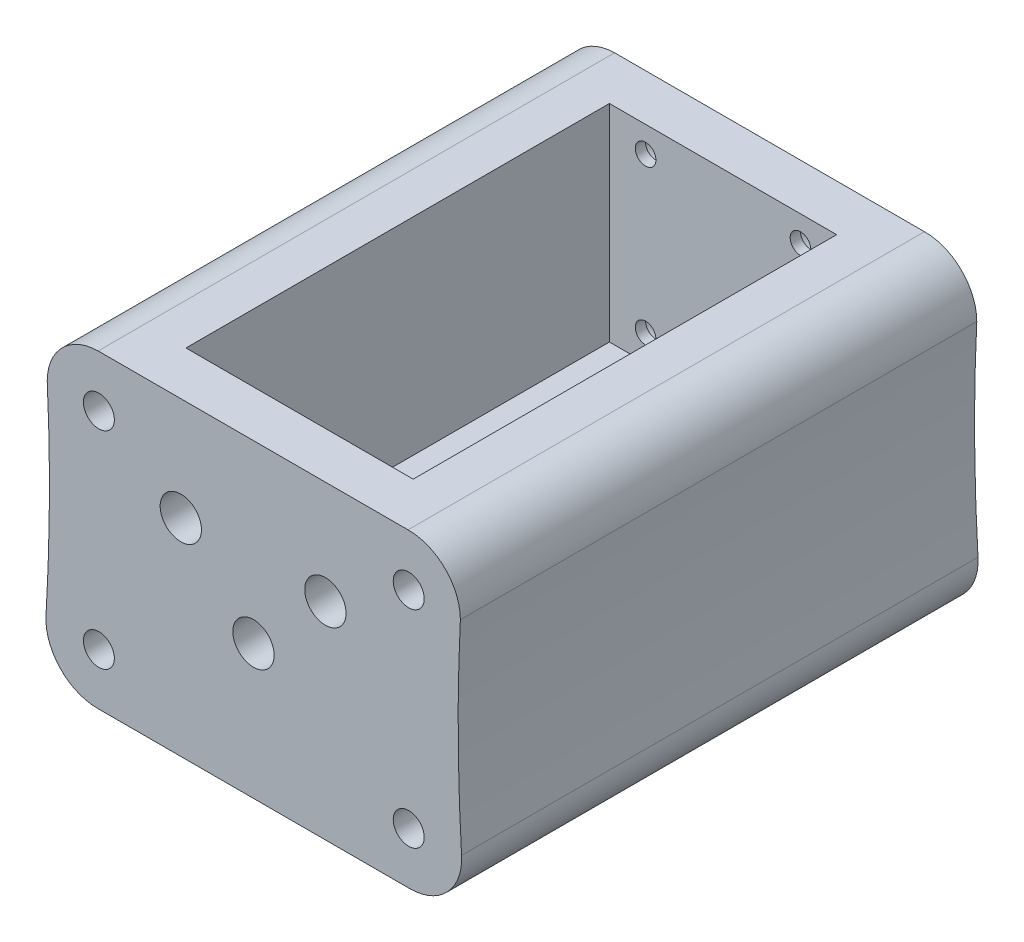
ISO-10303-21;
HEADER;
FILE_DESCRIPTION(('STEP AP214'),'2;1');
FILE_NAME('part.step','',(''),(''),'','','');
FILE_SCHEMA(('AUTOMOTIVE_DESIGN { 1 0 10303 214 1 1 1 1 }'));
ENDSEC;
DATA;
#1=APPLICATION_CONTEXT('core data for automotive mechanical design processes');
#2=APPLICATION_PROTOCOL_DEFINITION('international standard','automotive_design',2000,#1);
#3=PRODUCT_CONTEXT('',#1,'mechanical');
#4=PRODUCT('Part','Part','',(#3));
#5=PRODUCT_RELATED_PRODUCT_CATEGORY('part','',(#4));
#6=PRODUCT_DEFINITION_FORMATION('','',#4);
#7=PRODUCT_DEFINITION_CONTEXT('part definition',#1,'design');
#8=PRODUCT_DEFINITION('design','',#6,#7);
#9=PRODUCT_DEFINITION_SHAPE('','',#8);
#10=(LENGTH_UNIT() NAMED_UNIT(*) SI_UNIT(.MILLI.,.METRE.));
#11=(NAMED_UNIT(*) PLANE_ANGLE_UNIT() SI_UNIT($,.RADIAN.));
#12=(NAMED_UNIT(*) SI_UNIT($,.STERADIAN.) SOLID_ANGLE_UNIT());
#13=UNCERTAINTY_MEASURE_WITH_UNIT(LENGTH_MEASURE(1.E-05),#10,'distance_accuracy_value','');
#14=(GEOMETRIC_REPRESENTATION_CONTEXT(3) GLOBAL_UNCERTAINTY_ASSIGNED_CONTEXT((#13)) GLOBAL_UNIT_ASSIGNED_CONTEXT((#10,
#11,#12)) REPRESENTATION_CONTEXT('',''));
#15=CARTESIAN_POINT('',(0.,0.,0.));
#16=DIRECTION('',(0.,0.,1.));
#17=DIRECTION('',(1.,0.,0.));
#18=AXIS2_PLACEMENT_3D('',#15,#16,#17);
#19=CARTESIAN_POINT('',(177.194740337605,141.828214412946,50.));
#20=DIRECTION('',(0.,0.,1.));
#21=DIRECTION('',(0.707106781186132,0.707106781186964,0.));
#22=AXIS2_PLACEMENT_3D('',#19,#20,#21);
#23=PLANE('',#22);
#24=CARTESIAN_POINT('',(172.275703017034,137.501362695632,50.));
#25=DIRECTION('',(0.,0.,-1.));
#26=DIRECTION('',(-1.,0.,0.));
#27=AXIS2_PLACEMENT_3D('',#24,#25,#26);
#28=CIRCLE('',#27,1.5);
#29=CARTESIAN_POINT('',(170.775703017034,137.501362695632,50.));
#30=VERTEX_POINT('',#29);
#31=EDGE_CURVE('E415',#30,#30,#28,.T.);
#32=ORIENTED_EDGE('',*,*,#31,.T.);
#33=EDGE_LOOP('',(#32));
#34=FACE_BOUND('',#33,.T.);
#35=CARTESIAN_POINT('',(142.275703017034,137.501362695632,50.));
#36=DIRECTION('',(0.,0.,-1.));
#37=DIRECTION('',(-1.,0.,0.));
#38=AXIS2_PLACEMENT_3D('',#35,#36,#37);
#39=CIRCLE('',#38,1.5);
#40=CARTESIAN_POINT('',(140.775703017034,137.501362695632,50.));
#41=VERTEX_POINT('',#40);
#42=EDGE_CURVE('E392',#41,#41,#39,.T.);
#43=ORIENTED_EDGE('',*,*,#42,.T.);
#44=EDGE_LOOP('',(#43));
#45=FACE_BOUND('',#44,.T.);
#46=CARTESIAN_POINT('',(150.208932318114,152.50091684313,50.));
#47=DIRECTION('',(0.,0.,1.));
#48=DIRECTION('',(1.,0.,0.));
#49=AXIS2_PLACEMENT_3D('',#46,#47,#48);
#50=CIRCLE('',#49,2.);
#51=CARTESIAN_POINT('',(152.208932318114,152.50091684313,50.));
#52=VERTEX_POINT('',#51);
#53=EDGE_CURVE('E462',#52,#52,#50,.T.);
#54=ORIENTED_EDGE('',*,*,#53,.F.);
#55=EDGE_LOOP('',(#54));
#56=FACE_BOUND('',#55,.T.);
#57=CARTESIAN_POINT('',(164.208932318114,152.50091684313,50.));
#58=DIRECTION('',(0.,0.,1.));
#59=DIRECTION('',(1.,0.,0.));
#60=AXIS2_PLACEMENT_3D('',#57,#58,#59);
#61=CIRCLE('',#60,2.);
#62=CARTESIAN_POINT('',(166.208932318114,152.50091684313,50.));
#63=VERTEX_POINT('',#62);
#64=EDGE_CURVE('E465',#63,#63,#61,.T.);
#65=ORIENTED_EDGE('',*,*,#64,.F.);
#66=EDGE_LOOP('',(#65));
#67=FACE_BOUND('',#66,.T.);
#68=CARTESIAN_POINT('',(157.245778438082,145.500039202421,50.));
#69=DIRECTION('',(0.,0.,1.));
#70=DIRECTION('',(1.,0.,0.));
#71=AXIS2_PLACEMENT_3D('',#68,#69,#70);
#72=CIRCLE('',#71,2.);
#73=CARTESIAN_POINT('',(159.245778438082,145.500039202421,50.));
#74=VERTEX_POINT('',#73);
#75=EDGE_CURVE('E471',#74,#74,#72,.T.);
#76=ORIENTED_EDGE('',*,*,#75,.F.);
#77=EDGE_LOOP('',(#76));
#78=FACE_BOUND('',#77,.T.);
#79=CARTESIAN_POINT('',(142.275703017034,157.501362695614,50.));
#80=DIRECTION('',(0.,0.,1.));
#81=DIRECTION('',(0.707106781186132,0.707106781186964,0.));
#82=AXIS2_PLACEMENT_3D('',#79,#80,#81);
#83=CIRCLE('',#82,1.5);
#84=CARTESIAN_POINT('',(143.336363188814,158.562022867394,50.));
#85=VERTEX_POINT('',#84);
#86=EDGE_CURVE('E251',#85,#85,#83,.T.);
#87=ORIENTED_EDGE('',*,*,#86,.F.);
#88=EDGE_LOOP('',(#87));
#89=FACE_BOUND('',#88,.T.);
#90=CARTESIAN_POINT('',(172.275703017034,157.501362695632,50.));
#91=DIRECTION('',(0.,0.,1.));
#92=DIRECTION('',(0.707106781186132,0.707106781186964,0.));
#93=AXIS2_PLACEMENT_3D('',#90,#91,#92);
#94=CIRCLE('',#93,1.5);
#95=CARTESIAN_POINT('',(173.336363188814,158.562022867412,50.));
#96=VERTEX_POINT('',#95);
#97=EDGE_CURVE('E245',#96,#96,#94,.T.);
#98=ORIENTED_EDGE('',*,*,#97,.F.);
#99=EDGE_LOOP('',(#98));
#100=FACE_BOUND('',#99,.T.);
#101=CARTESIAN_POINT('',(136.062499581457,125.780583309189,50.));
#102=CARTESIAN_POINT('',(138.044230093719,142.015455823445,50.));
#103=CARTESIAN_POINT('',(137.275703017034,157.501362695611,50.));
#104=B_SPLINE_CURVE_WITH_KNOTS('',2,(#101,#102,#103),.UNSPECIFIED.,.F.,.F.,(3,3),
(0.858942570117713,1.),.UNSPECIFIED.);
#105=CARTESIAN_POINT('',(137.158975360515,137.800044447791,50.));
#106=VERTEX_POINT('',#105);
#107=CARTESIAN_POINT('',(137.275703017034,157.501362695611,50.));
#108=VERTEX_POINT('',#107);
#109=EDGE_CURVE('E310',#106,#108,#104,.T.);
#110=ORIENTED_EDGE('',*,*,#109,.F.);
#111=CARTESIAN_POINT('',(142.150046308811,137.501362695632,50.));
#112=DIRECTION('',(0.,0.,1.));
#113=DIRECTION('',(1.,0.,0.));
#114=AXIS2_PLACEMENT_3D('',#111,#112,#113);
#115=CIRCLE('',#114,5.);
#116=CARTESIAN_POINT('',(142.150046308811,132.501362695632,50.));
#117=VERTEX_POINT('',#116);
#118=EDGE_CURVE('E115',#106,#117,#115,.T.);
#119=ORIENTED_EDGE('',*,*,#118,.T.);
#120=DIRECTION('',(-1.,0.,0.));
#121=VECTOR('',#120,1.);
#122=CARTESIAN_POINT('',(0.,132.501362695632,50.));
#123=LINE('',#122,#121);
#124=CARTESIAN_POINT('',(172.401359725282,132.501362695632,50.));
#125=VERTEX_POINT('',#124);
#126=EDGE_CURVE('E386',#125,#117,#123,.T.);
#127=ORIENTED_EDGE('',*,*,#126,.F.);
#128=CARTESIAN_POINT('',(172.401359725282,137.501362695632,50.));
#129=DIRECTION('',(0.,0.,1.));
#130=DIRECTION('',(1.,0.,0.));
#131=AXIS2_PLACEMENT_3D('',#128,#129,#130);
#132=CIRCLE('',#131,5.);
#133=CARTESIAN_POINT('',(177.392430673578,137.800044447798,50.));
#134=VERTEX_POINT('',#133);
#135=EDGE_CURVE('E122',#125,#134,#132,.T.);
#136=ORIENTED_EDGE('',*,*,#135,.T.);
#137=CARTESIAN_POINT('',(178.48890645265,125.780583309214,50.));
#138=CARTESIAN_POINT('',(176.507175940368,142.015455823467,50.));
#139=CARTESIAN_POINT('',(177.275703017034,157.501362695635,50.));
#140=B_SPLINE_CURVE_WITH_KNOTS('',2,(#137,#138,#139),.UNSPECIFIED.,.F.,.F.,(3,3),
(0.858942570117713,1.),.UNSPECIFIED.);
#141=CARTESIAN_POINT('',(177.275703017034,157.501362695635,50.));
#142=VERTEX_POINT('',#141);
#143=EDGE_CURVE('E257',#134,#142,#140,.T.);
#144=ORIENTED_EDGE('',*,*,#143,.T.);
#145=CARTESIAN_POINT('',(172.275703017034,157.501362695632,50.));
#146=DIRECTION('',(0.,0.,1.));
#147=DIRECTION('',(0.707106781186132,0.707106781186964,0.));
#148=AXIS2_PLACEMENT_3D('',#145,#146,#147);
#149=CIRCLE('',#148,4.99999999999998);
#150=CARTESIAN_POINT('',(172.208932318114,162.50091684313,50.));
#151=VERTEX_POINT('',#150);
#152=EDGE_CURVE('E262',#142,#151,#149,.T.);
#153=ORIENTED_EDGE('',*,*,#152,.T.);
#154=DIRECTION('',(-1.,-5.88917803412414E-13,0.));
#155=VECTOR('',#154,1.);
#156=CARTESIAN_POINT('',(172.208932318114,162.50091684313,50.));
#157=LINE('',#156,#155);
#158=CARTESIAN_POINT('',(142.208932318114,162.500916843112,50.));
#159=VERTEX_POINT('',#158);
#160=EDGE_CURVE('E408',#151,#159,#157,.T.);
#161=ORIENTED_EDGE('',*,*,#160,.T.);
#162=CARTESIAN_POINT('',(142.275703017034,157.501362695614,50.));
#163=DIRECTION('',(0.,0.,-1.));
#164=DIRECTION('',(-0.707106781186132,-0.707106781186964,0.));
#165=AXIS2_PLACEMENT_3D('',#162,#163,#164);
#166=CIRCLE('',#165,4.99999999999998);
#167=EDGE_CURVE('E317',#108,#159,#166,.T.);
#168=ORIENTED_EDGE('',*,*,#167,.F.);
#169=EDGE_LOOP('',(#110,#119,#127,#136,#144,#153,#161,#168));
#170=FACE_BOUND('',#169,.T.);
#171=ADVANCED_FACE('F107',(#34,#45,#56,#67,#78,#89,#100,#170),#23,.T.);
#172=CARTESIAN_POINT('',(177.194740337605,141.828214412946,0.));
#173=DIRECTION('',(0.,0.,1.));
#174=DIRECTION('',(0.707106781186132,0.707106781186964,0.));
#175=AXIS2_PLACEMENT_3D('',#172,#173,#174);
#176=PLANE('',#175);
#177=CARTESIAN_POINT('',(172.275703017034,157.501362695632,0.));
#178=DIRECTION('',(0.,0.,1.));
#179=DIRECTION('',(0.707106781186132,0.707106781186964,0.));
#180=AXIS2_PLACEMENT_3D('',#177,#178,#179);
#181=CIRCLE('',#180,1.5);
#182=CARTESIAN_POINT('',(173.336363188814,158.562022867412,0.));
#183=VERTEX_POINT('',#182);
#184=EDGE_CURVE('E241',#183,#183,#181,.T.);
#185=ORIENTED_EDGE('',*,*,#184,.T.);
#186=EDGE_LOOP('',(#185));
#187=FACE_BOUND('',#186,.T.);
#188=CARTESIAN_POINT('',(142.275703017034,157.501362695614,0.));
#189=DIRECTION('',(0.,0.,1.));
#190=DIRECTION('',(0.707106781186132,0.707106781186964,0.));
#191=AXIS2_PLACEMENT_3D('',#188,#189,#190);
#192=CIRCLE('',#191,1.5);
#193=CARTESIAN_POINT('',(143.336363188814,158.562022867394,0.));
#194=VERTEX_POINT('',#193);
#195=EDGE_CURVE('E248',#194,#194,#192,.T.);
#196=ORIENTED_EDGE('',*,*,#195,.T.);
#197=EDGE_LOOP('',(#196));
#198=FACE_BOUND('',#197,.T.);
#199=CARTESIAN_POINT('',(164.708932319671,160.000916844687,0.));
#200=DIRECTION('',(0.,0.,-1.));
#201=DIRECTION('',(-1.,0.,0.));
#202=AXIS2_PLACEMENT_3D('',#199,#200,#201);
#203=CIRCLE('',#202,2.);
#204=CARTESIAN_POINT('',(162.708932319671,160.000916844687,0.));
#205=VERTEX_POINT('',#204);
#206=EDGE_CURVE('E429',#205,#205,#203,.T.);
#207=ORIENTED_EDGE('',*,*,#206,.F.);
#208=EDGE_LOOP('',(#207));
#209=FACE_BOUND('',#208,.T.);
#210=CARTESIAN_POINT('',(149.708932316557,160.000916844687,0.));
#211=DIRECTION('',(0.,0.,-1.));
#212=DIRECTION('',(-1.,0.,0.));
#213=AXIS2_PLACEMENT_3D('',#210,#211,#212);
#214=CIRCLE('',#213,2.);
#215=CARTESIAN_POINT('',(147.708932316557,160.000916844687,0.));
#216=VERTEX_POINT('',#215);
#217=EDGE_CURVE('E426',#216,#216,#214,.T.);
#218=ORIENTED_EDGE('',*,*,#217,.F.);
#219=EDGE_LOOP('',(#218));
#220=FACE_BOUND('',#219,.T.);
#221=CARTESIAN_POINT('',(149.708932316557,145.000916841573,0.));
#222=DIRECTION('',(0.,0.,-1.));
#223=DIRECTION('',(-1.,0.,0.));
#224=AXIS2_PLACEMENT_3D('',#221,#222,#223);
#225=CIRCLE('',#224,2.);
#226=CARTESIAN_POINT('',(147.708932316557,145.000916841573,0.));
#227=VERTEX_POINT('',#226);
#228=EDGE_CURVE('E433',#227,#227,#225,.T.);
#229=ORIENTED_EDGE('',*,*,#228,.F.);
#230=EDGE_LOOP('',(#229));
#231=FACE_BOUND('',#230,.T.);
#232=CARTESIAN_POINT('',(164.708932319671,145.000916841573,0.));
#233=DIRECTION('',(0.,0.,-1.));
#234=DIRECTION('',(-1.,0.,0.));
#235=AXIS2_PLACEMENT_3D('',#232,#233,#234);
#236=CIRCLE('',#235,2.);
#237=CARTESIAN_POINT('',(162.708932319671,145.000916841573,0.));
#238=VERTEX_POINT('',#237);
#239=EDGE_CURVE('E439',#238,#238,#236,.T.);
#240=ORIENTED_EDGE('',*,*,#239,.F.);
#241=EDGE_LOOP('',(#240));
#242=FACE_BOUND('',#241,.T.);
#243=CARTESIAN_POINT('',(142.275703017034,137.501362695632,0.));
#244=DIRECTION('',(0.,0.,-1.));
#245=DIRECTION('',(-1.,0.,0.));
#246=AXIS2_PLACEMENT_3D('',#243,#244,#245);
#247=CIRCLE('',#246,1.5);
#248=CARTESIAN_POINT('',(140.775703017034,137.501362695632,0.));
#249=VERTEX_POINT('',#248);
#250=EDGE_CURVE('E421',#249,#249,#247,.T.);
#251=ORIENTED_EDGE('',*,*,#250,.F.);
#252=EDGE_LOOP('',(#251));
#253=FACE_BOUND('',#252,.T.);
#254=CARTESIAN_POINT('',(172.275703017034,137.501362695632,0.));
#255=DIRECTION('',(0.,0.,-1.));
#256=DIRECTION('',(-1.,0.,0.));
#257=AXIS2_PLACEMENT_3D('',#254,#255,#256);
#258=CIRCLE('',#257,1.5);
#259=CARTESIAN_POINT('',(170.775703017034,137.501362695632,0.));
#260=VERTEX_POINT('',#259);
#261=EDGE_CURVE('E418',#260,#260,#258,.T.);
#262=ORIENTED_EDGE('',*,*,#261,.F.);
#263=EDGE_LOOP('',(#262));
#264=FACE_BOUND('',#263,.T.);
#265=DIRECTION('',(-1.,0.,0.));
#266=VECTOR('',#265,1.);
#267=CARTESIAN_POINT('',(0.,132.501362695632,0.));
#268=LINE('',#267,#266);
#269=CARTESIAN_POINT('',(172.401359725282,132.501362695632,0.));
#270=VERTEX_POINT('',#269);
#271=CARTESIAN_POINT('',(142.150046308811,132.501362695632,0.));
#272=VERTEX_POINT('',#271);
#273=EDGE_CURVE('E393',#270,#272,#268,.T.);
#274=ORIENTED_EDGE('',*,*,#273,.T.);
#275=CARTESIAN_POINT('',(142.150046308811,137.501362695632,0.));
#276=DIRECTION('',(0.,0.,1.));
#277=DIRECTION('',(1.,0.,0.));
#278=AXIS2_PLACEMENT_3D('',#275,#276,#277);
#279=CIRCLE('',#278,5.);
#280=CARTESIAN_POINT('',(137.158975360515,137.800044447791,0.));
#281=VERTEX_POINT('',#280);
#282=EDGE_CURVE('E382',#272,#281,#279,.F.);
#283=ORIENTED_EDGE('',*,*,#282,.T.);
#284=CARTESIAN_POINT('',(136.062499581457,125.780583309189,0.));
#285=CARTESIAN_POINT('',(138.044230093719,142.015455823445,0.));
#286=CARTESIAN_POINT('',(137.275703017034,157.501362695611,0.));
#287=B_SPLINE_CURVE_WITH_KNOTS('',2,(#284,#285,#286),.UNSPECIFIED.,.F.,.F.,(3,3),
(0.858942570117713,1.),.UNSPECIFIED.);
#288=CARTESIAN_POINT('',(137.275703017034,157.501362695611,0.));
#289=VERTEX_POINT('',#288);
#290=EDGE_CURVE('E263',#281,#289,#287,.T.);
#291=ORIENTED_EDGE('',*,*,#290,.T.);
#292=CARTESIAN_POINT('',(142.275703017034,157.501362695614,0.));
#293=DIRECTION('',(0.,0.,-1.));
#294=DIRECTION('',(-0.707106781186132,-0.707106781186964,0.));
#295=AXIS2_PLACEMENT_3D('',#292,#293,#294);
#296=CIRCLE('',#295,4.99999999999998);
#297=CARTESIAN_POINT('',(142.208932318114,162.500916843112,0.));
#298=VERTEX_POINT('',#297);
#299=EDGE_CURVE('E332',#289,#298,#296,.T.);
#300=ORIENTED_EDGE('',*,*,#299,.T.);
#301=DIRECTION('',(-1.,-5.88917803412414E-13,0.));
#302=VECTOR('',#301,1.);
#303=CARTESIAN_POINT('',(172.208932318114,162.50091684313,0.));
#304=LINE('',#303,#302);
#305=CARTESIAN_POINT('',(172.208932318114,162.50091684313,0.));
#306=VERTEX_POINT('',#305);
#307=EDGE_CURVE('E329',#306,#298,#304,.T.);
#308=ORIENTED_EDGE('',*,*,#307,.F.);
#309=CARTESIAN_POINT('',(172.275703017034,157.501362695632,0.));
#310=DIRECTION('',(0.,0.,1.));
#311=DIRECTION('',(0.707106781186132,0.707106781186964,0.));
#312=AXIS2_PLACEMENT_3D('',#309,#310,#311);
#313=CIRCLE('',#312,4.99999999999998);
#314=CARTESIAN_POINT('',(177.275703017034,157.501362695635,0.));
#315=VERTEX_POINT('',#314);
#316=EDGE_CURVE('E324',#315,#306,#313,.T.);
#317=ORIENTED_EDGE('',*,*,#316,.F.);
#318=CARTESIAN_POINT('',(178.48890645265,125.780583309214,0.));
#319=CARTESIAN_POINT('',(176.507175940368,142.015455823467,0.));
#320=CARTESIAN_POINT('',(177.275703017034,157.501362695635,0.));
#321=B_SPLINE_CURVE_WITH_KNOTS('',2,(#318,#319,#320),.UNSPECIFIED.,.F.,.F.,(3,3),
(0.858942570117713,1.),.UNSPECIFIED.);
#322=CARTESIAN_POINT('',(177.392430673578,137.800044447798,0.));
#323=VERTEX_POINT('',#322);
#324=EDGE_CURVE('E254',#323,#315,#321,.T.);
#325=ORIENTED_EDGE('',*,*,#324,.F.);
#326=CARTESIAN_POINT('',(172.401359725282,137.501362695632,0.));
#327=DIRECTION('',(0.,0.,1.));
#328=DIRECTION('',(1.,0.,0.));
#329=AXIS2_PLACEMENT_3D('',#326,#327,#328);
#330=CIRCLE('',#329,5.);
#331=EDGE_CURVE('E380',#323,#270,#330,.F.);
#332=ORIENTED_EDGE('',*,*,#331,.T.);
#333=EDGE_LOOP('',(#274,#283,#291,#300,#308,#317,#325,#332));
#334=FACE_BOUND('',#333,.T.);
#335=ADVANCED_FACE('F273',(#187,#198,#209,#220,#231,#242,#253,#264,#334),#176,.F.);
#336=DIRECTION('',(0.,0.,-1.));
#337=VECTOR('',#336,1.);
#338=SURFACE_OF_LINEAR_EXTRUSION('',#140,#337);
#339=ORIENTED_EDGE('',*,*,#143,.F.);
#340=DIRECTION('',(0.,0.,-1.));
#341=VECTOR('',#340,1.);
#342=CARTESIAN_POINT('',(177.392430673578,137.800044447798,50.));
#343=LINE('',#342,#341);
#344=EDGE_CURVE('E12',#134,#323,#343,.T.);
#345=ORIENTED_EDGE('',*,*,#344,.T.);
#346=ORIENTED_EDGE('',*,*,#324,.T.);
#347=DIRECTION('',(0.,0.,-1.));
#348=VECTOR('',#347,1.);
#349=CARTESIAN_POINT('',(177.275703017034,157.501362695635,50.));
#350=LINE('',#349,#348);
#351=EDGE_CURVE('E348',#142,#315,#350,.T.);
#352=ORIENTED_EDGE('',*,*,#351,.F.);
#353=EDGE_LOOP('',(#339,#345,#346,#352));
#354=FACE_BOUND('',#353,.T.);
#355=ADVANCED_FACE('F269',(#354),#338,.F.);
#356=DIRECTION('',(0.,0.,-1.));
#357=VECTOR('',#356,1.);
#358=SURFACE_OF_LINEAR_EXTRUSION('',#104,#357);
#359=ORIENTED_EDGE('',*,*,#290,.F.);
#360=DIRECTION('',(0.,0.,-1.));
#361=VECTOR('',#360,1.);
#362=CARTESIAN_POINT('',(137.158975360515,137.800044447791,0.));
#363=LINE('',#362,#361);
#364=EDGE_CURVE('E130',#281,#106,#363,.F.);
#365=ORIENTED_EDGE('',*,*,#364,.T.);
#366=ORIENTED_EDGE('',*,*,#109,.T.);
#367=DIRECTION('',(0.,0.,-1.));
#368=VECTOR('',#367,1.);
#369=CARTESIAN_POINT('',(137.275703017034,157.501362695611,50.));
#370=LINE('',#369,#368);
#371=EDGE_CURVE('E316',#108,#289,#370,.T.);
#372=ORIENTED_EDGE('',*,*,#371,.T.);
#373=EDGE_LOOP('',(#359,#365,#366,#372));
#374=FACE_BOUND('',#373,.T.);
#375=ADVANCED_FACE('F272',(#374),#358,.T.);
#376=CARTESIAN_POINT('',(164.708932319671,160.000916844687,50.001));
#377=DIRECTION('',(0.,0.,-1.));
#378=DIRECTION('',(-1.,0.,0.));
#379=AXIS2_PLACEMENT_3D('',#376,#377,#378);
#380=CYLINDRICAL_SURFACE('',#379,0.999999999999998);
#381=CARTESIAN_POINT('',(164.708932319671,160.000916844687,4.50000000000003));
#382=DIRECTION('',(0.,0.,-1.));
#383=DIRECTION('',(-1.,0.,0.));
#384=AXIS2_PLACEMENT_3D('',#381,#382,#383);
#385=CIRCLE('',#384,0.999999999999998);
#386=CARTESIAN_POINT('',(163.708932319671,160.000916844687,4.50000000000003));
#387=VERTEX_POINT('',#386);
#388=EDGE_CURVE('E451',#387,#387,#385,.F.);
#389=ORIENTED_EDGE('',*,*,#388,.T.);
#390=EDGE_LOOP('',(#389));
#391=FACE_BOUND('',#390,.T.);
#392=CARTESIAN_POINT('',(164.708932319671,160.000916844687,3.5));
#393=DIRECTION('',(0.,0.,-1.));
#394=DIRECTION('',(-1.,0.,0.));
#395=AXIS2_PLACEMENT_3D('',#392,#393,#394);
#396=CIRCLE('',#395,0.999999999999998);
#397=CARTESIAN_POINT('',(163.708932319671,160.000916844687,3.5));
#398=VERTEX_POINT('',#397);
#399=EDGE_CURVE('E372',#398,#398,#396,.F.);
#400=ORIENTED_EDGE('',*,*,#399,.F.);
#401=EDGE_LOOP('',(#400));
#402=FACE_BOUND('',#401,.T.);
#403=ADVANCED_FACE('F308',(#391,#402),#380,.F.);
#404=CARTESIAN_POINT('',(149.708932316557,145.000916841573,50.001));
#405=DIRECTION('',(0.,0.,-1.));
#406=DIRECTION('',(-1.,0.,0.));
#407=AXIS2_PLACEMENT_3D('',#404,#405,#406);
#408=CYLINDRICAL_SURFACE('',#407,0.999999999999998);
#409=CARTESIAN_POINT('',(149.708932316557,145.000916841573,4.50000000000003));
#410=DIRECTION('',(0.,0.,-1.));
#411=DIRECTION('',(-1.,0.,0.));
#412=AXIS2_PLACEMENT_3D('',#409,#410,#411);
#413=CIRCLE('',#412,0.999999999999998);
#414=CARTESIAN_POINT('',(148.708932316557,145.000916841573,4.50000000000003));
#415=VERTEX_POINT('',#414);
#416=EDGE_CURVE('E448',#415,#415,#413,.F.);
#417=ORIENTED_EDGE('',*,*,#416,.T.);
#418=EDGE_LOOP('',(#417));
#419=FACE_BOUND('',#418,.T.);
#420=CARTESIAN_POINT('',(149.708932316557,145.000916841573,3.5));
#421=DIRECTION('',(0.,0.,-1.));
#422=DIRECTION('',(-1.,0.,0.));
#423=AXIS2_PLACEMENT_3D('',#420,#421,#422);
#424=CIRCLE('',#423,0.999999999999998);
#425=CARTESIAN_POINT('',(148.708932316557,145.000916841573,3.5));
#426=VERTEX_POINT('',#425);
#427=EDGE_CURVE('E369',#426,#426,#424,.F.);
#428=ORIENTED_EDGE('',*,*,#427,.F.);
#429=EDGE_LOOP('',(#428));
#430=FACE_BOUND('',#429,.T.);
#431=ADVANCED_FACE('F577',(#419,#430),#408,.F.);
#432=CARTESIAN_POINT('',(164.708932319671,145.000916841573,50.001));
#433=DIRECTION('',(0.,0.,-1.));
#434=DIRECTION('',(-1.,0.,0.));
#435=AXIS2_PLACEMENT_3D('',#432,#433,#434);
#436=CYLINDRICAL_SURFACE('',#435,0.999999999999998);
#437=CARTESIAN_POINT('',(164.708932319671,145.000916841573,4.50000000000003));
#438=DIRECTION('',(0.,0.,-1.));
#439=DIRECTION('',(-1.,0.,0.));
#440=AXIS2_PLACEMENT_3D('',#437,#438,#439);
#441=CIRCLE('',#440,0.999999999999998);
#442=CARTESIAN_POINT('',(163.708932319671,145.000916841573,4.50000000000003));
#443=VERTEX_POINT('',#442);
#444=EDGE_CURVE('E452',#443,#443,#441,.F.);
#445=ORIENTED_EDGE('',*,*,#444,.T.);
#446=EDGE_LOOP('',(#445));
#447=FACE_BOUND('',#446,.T.);
#448=CARTESIAN_POINT('',(164.708932319671,145.000916841573,3.5));
#449=DIRECTION('',(0.,0.,-1.));
#450=DIRECTION('',(-1.,0.,0.));
#451=AXIS2_PLACEMENT_3D('',#448,#449,#450);
#452=CIRCLE('',#451,0.999999999999998);
#453=CARTESIAN_POINT('',(163.708932319671,145.000916841573,3.5));
#454=VERTEX_POINT('',#453);
#455=EDGE_CURVE('E365',#454,#454,#452,.F.);
#456=ORIENTED_EDGE('',*,*,#455,.F.);
#457=EDGE_LOOP('',(#456));
#458=FACE_BOUND('',#457,.T.);
#459=ADVANCED_FACE('F580',(#447,#458),#436,.F.);
#460=CARTESIAN_POINT('',(149.708932316557,160.000916844687,50.001));
#461=DIRECTION('',(0.,0.,-1.));
#462=DIRECTION('',(-1.,0.,0.));
#463=AXIS2_PLACEMENT_3D('',#460,#461,#462);
#464=CYLINDRICAL_SURFACE('',#463,0.999999999999998);
#465=CARTESIAN_POINT('',(149.708932316557,160.000916844687,4.50000000000003));
#466=DIRECTION('',(0.,0.,-1.));
#467=DIRECTION('',(-1.,0.,0.));
#468=AXIS2_PLACEMENT_3D('',#465,#466,#467);
#469=CIRCLE('',#468,0.999999999999998);
#470=CARTESIAN_POINT('',(148.708932316557,160.000916844687,4.50000000000003));
#471=VERTEX_POINT('',#470);
#472=EDGE_CURVE('E375',#471,#471,#469,.F.);
#473=ORIENTED_EDGE('',*,*,#472,.T.);
#474=EDGE_LOOP('',(#473));
#475=FACE_BOUND('',#474,.T.);
#476=CARTESIAN_POINT('',(149.708932316557,160.000916844687,3.5));
#477=DIRECTION('',(0.,0.,-1.));
#478=DIRECTION('',(-1.,0.,0.));
#479=AXIS2_PLACEMENT_3D('',#476,#477,#478);
#480=CIRCLE('',#479,0.999999999999998);
#481=CARTESIAN_POINT('',(148.708932316557,160.000916844687,3.5));
#482=VERTEX_POINT('',#481);
#483=EDGE_CURVE('E362',#482,#482,#480,.F.);
#484=ORIENTED_EDGE('',*,*,#483,.F.);
#485=EDGE_LOOP('',(#484));
#486=FACE_BOUND('',#485,.T.);
#487=ADVANCED_FACE('F584',(#475,#486),#464,.F.);
#488=CARTESIAN_POINT('',(157.245778438082,145.500039202421,-0.001000000000001));
#489=DIRECTION('',(0.,0.,1.));
#490=DIRECTION('',(1.,0.,0.));
#491=AXIS2_PLACEMENT_3D('',#488,#489,#490);
#492=CYLINDRICAL_SURFACE('',#491,0.999999999999998);
#493=CARTESIAN_POINT('',(157.245778438082,145.500039202421,45.5));
#494=DIRECTION('',(0.,0.,1.));
#495=DIRECTION('',(1.,0.,0.));
#496=AXIS2_PLACEMENT_3D('',#493,#494,#495);
#497=CIRCLE('',#496,0.999999999999998);
#498=CARTESIAN_POINT('',(158.245778438082,145.500039202421,45.5));
#499=VERTEX_POINT('',#498);
#500=EDGE_CURVE('E228',#499,#499,#497,.F.);
#501=ORIENTED_EDGE('',*,*,#500,.T.);
#502=EDGE_LOOP('',(#501));
#503=FACE_BOUND('',#502,.T.);
#504=CARTESIAN_POINT('',(157.245778438082,145.500039202421,46.5));
#505=DIRECTION('',(0.,0.,1.));
#506=DIRECTION('',(1.,0.,0.));
#507=AXIS2_PLACEMENT_3D('',#504,#505,#506);
#508=CIRCLE('',#507,0.999999999999998);
#509=CARTESIAN_POINT('',(158.245778438082,145.500039202421,46.5));
#510=VERTEX_POINT('',#509);
#511=EDGE_CURVE('E359',#510,#510,#508,.F.);
#512=ORIENTED_EDGE('',*,*,#511,.F.);
#513=EDGE_LOOP('',(#512));
#514=FACE_BOUND('',#513,.T.);
#515=ADVANCED_FACE('F484',(#503,#514),#492,.F.);
#516=CARTESIAN_POINT('',(164.208932318114,152.50091684313,-0.001000000000001));
#517=DIRECTION('',(0.,0.,1.));
#518=DIRECTION('',(1.,0.,0.));
#519=AXIS2_PLACEMENT_3D('',#516,#517,#518);
#520=CYLINDRICAL_SURFACE('',#519,0.999999999999998);
#521=CARTESIAN_POINT('',(164.208932318114,152.50091684313,45.5));
#522=DIRECTION('',(0.,0.,1.));
#523=DIRECTION('',(1.,0.,0.));
#524=AXIS2_PLACEMENT_3D('',#521,#522,#523);
#525=CIRCLE('',#524,0.999999999999998);
#526=CARTESIAN_POINT('',(165.208932318114,152.50091684313,45.5));
#527=VERTEX_POINT('',#526);
#528=EDGE_CURVE('E477',#527,#527,#525,.F.);
#529=ORIENTED_EDGE('',*,*,#528,.T.);
#530=EDGE_LOOP('',(#529));
#531=FACE_BOUND('',#530,.T.);
#532=CARTESIAN_POINT('',(164.208932318114,152.50091684313,46.5));
#533=DIRECTION('',(0.,0.,1.));
#534=DIRECTION('',(1.,0.,0.));
#535=AXIS2_PLACEMENT_3D('',#532,#533,#534);
#536=CIRCLE('',#535,0.999999999999998);
#537=CARTESIAN_POINT('',(165.208932318114,152.50091684313,46.5));
#538=VERTEX_POINT('',#537);
#539=EDGE_CURVE('E355',#538,#538,#536,.F.);
#540=ORIENTED_EDGE('',*,*,#539,.F.);
#541=EDGE_LOOP('',(#540));
#542=FACE_BOUND('',#541,.T.);
#543=ADVANCED_FACE('F618',(#531,#542),#520,.F.);
#544=CARTESIAN_POINT('',(150.208932318114,152.50091684313,-0.001000000000001));
#545=DIRECTION('',(0.,0.,1.));
#546=DIRECTION('',(1.,0.,0.));
#547=AXIS2_PLACEMENT_3D('',#544,#545,#546);
#548=CYLINDRICAL_SURFACE('',#547,0.999999999999998);
#549=CARTESIAN_POINT('',(150.208932318114,152.50091684313,45.5));
#550=DIRECTION('',(0.,0.,1.));
#551=DIRECTION('',(1.,0.,0.));
#552=AXIS2_PLACEMENT_3D('',#549,#550,#551);
#553=CIRCLE('',#552,0.999999999999998);
#554=CARTESIAN_POINT('',(151.208932318114,152.50091684313,45.5));
#555=VERTEX_POINT('',#554);
#556=EDGE_CURVE('E235',#555,#555,#553,.F.);
#557=ORIENTED_EDGE('',*,*,#556,.T.);
#558=EDGE_LOOP('',(#557));
#559=FACE_BOUND('',#558,.T.);
#560=CARTESIAN_POINT('',(150.208932318114,152.50091684313,46.5));
#561=DIRECTION('',(0.,0.,1.));
#562=DIRECTION('',(1.,0.,0.));
#563=AXIS2_PLACEMENT_3D('',#560,#561,#562);
#564=CIRCLE('',#563,0.999999999999998);
#565=CARTESIAN_POINT('',(151.208932318114,152.50091684313,46.5));
#566=VERTEX_POINT('',#565);
#567=EDGE_CURVE('E352',#566,#566,#564,.F.);
#568=ORIENTED_EDGE('',*,*,#567,.F.);
#569=EDGE_LOOP('',(#568));
#570=FACE_BOUND('',#569,.T.);
#571=ADVANCED_FACE('F615',(#559,#570),#548,.F.);
#572=CARTESIAN_POINT('',(172.275703017034,157.501362695632,50.));
#573=DIRECTION('',(0.,0.,-1.));
#574=DIRECTION('',(-0.707106781186132,-0.707106781186964,0.));
#575=AXIS2_PLACEMENT_3D('',#572,#573,#574);
#576=CYLINDRICAL_SURFACE('',#575,4.99999999999998);
#577=ORIENTED_EDGE('',*,*,#316,.T.);
#578=DIRECTION('',(0.,0.,-1.));
#579=VECTOR('',#578,1.);
#580=CARTESIAN_POINT('',(172.208932318114,162.50091684313,50.));
#581=LINE('',#580,#579);
#582=EDGE_CURVE('E345',#151,#306,#581,.T.);
#583=ORIENTED_EDGE('',*,*,#582,.F.);
#584=ORIENTED_EDGE('',*,*,#152,.F.);
#585=ORIENTED_EDGE('',*,*,#351,.T.);
#586=EDGE_LOOP('',(#577,#583,#584,#585));
#587=FACE_BOUND('',#586,.T.);
#588=ADVANCED_FACE('F275',(#587),#576,.T.);
#589=CARTESIAN_POINT('',(172.208932318114,162.50091684313,50.));
#590=DIRECTION('',(5.88806781109952E-13,-1.,0.));
#591=DIRECTION('',(1.,5.88862292261183E-13,0.));
#592=AXIS2_PLACEMENT_3D('',#589,#590,#591);
#593=PLANE('',#592);
#594=DIRECTION('',(-1.,-5.87913556221958E-13,0.));
#595=VECTOR('',#594,1.);
#596=CARTESIAN_POINT('',(146.208932318114,162.500916843114,4.50000000000003));
#597=LINE('',#596,#595);
#598=CARTESIAN_POINT('',(168.208932318126,162.500916843127,4.50000000000003));
#599=VERTEX_POINT('',#598);
#600=CARTESIAN_POINT('',(146.208932318114,162.500916843114,4.50000000000003));
#601=VERTEX_POINT('',#600);
#602=EDGE_CURVE('E234',#599,#601,#597,.T.);
#603=ORIENTED_EDGE('',*,*,#602,.F.);
#604=DIRECTION('',(0.,0.,-1.));
#605=VECTOR('',#604,1.);
#606=CARTESIAN_POINT('',(168.208932318114,162.500916843127,45.5));
#607=LINE('',#606,#605);
#608=CARTESIAN_POINT('',(168.208932318114,162.500916843127,45.5));
#609=VERTEX_POINT('',#608);
#610=EDGE_CURVE('E205',#609,#599,#607,.T.);
#611=ORIENTED_EDGE('',*,*,#610,.F.);
#612=DIRECTION('',(1.,5.87913556221958E-13,0.));
#613=VECTOR('',#612,1.);
#614=CARTESIAN_POINT('',(146.208932318114,162.500916843114,45.5));
#615=LINE('',#614,#613);
#616=CARTESIAN_POINT('',(146.208932318114,162.500916843114,45.5));
#617=VERTEX_POINT('',#616);
#618=EDGE_CURVE('E222',#617,#609,#615,.T.);
#619=ORIENTED_EDGE('',*,*,#618,.F.);
#620=DIRECTION('',(0.,0.,1.));
#621=VECTOR('',#620,1.);
#622=CARTESIAN_POINT('',(146.208932318114,162.500916843114,45.5));
#623=LINE('',#622,#621);
#624=EDGE_CURVE('E225',#601,#617,#623,.T.);
#625=ORIENTED_EDGE('',*,*,#624,.F.);
#626=EDGE_LOOP('',(#603,#611,#619,#625));
#627=FACE_BOUND('',#626,.T.);
#628=ORIENTED_EDGE('',*,*,#307,.T.);
#629=DIRECTION('',(0.,0.,-1.));
#630=VECTOR('',#629,1.);
#631=CARTESIAN_POINT('',(142.208932318114,162.500916843112,50.));
#632=LINE('',#631,#630);
#633=EDGE_CURVE('E343',#159,#298,#632,.T.);
#634=ORIENTED_EDGE('',*,*,#633,.F.);
#635=ORIENTED_EDGE('',*,*,#160,.F.);
#636=ORIENTED_EDGE('',*,*,#582,.T.);
#637=EDGE_LOOP('',(#628,#634,#635,#636));
#638=FACE_BOUND('',#637,.T.);
#639=ADVANCED_FACE('F405',(#627,#638),#593,.F.);
#640=CARTESIAN_POINT('',(142.275703017034,157.501362695614,50.));
#641=DIRECTION('',(0.,0.,-1.));
#642=DIRECTION('',(-0.707106781186132,-0.707106781186964,0.));
#643=AXIS2_PLACEMENT_3D('',#640,#641,#642);
#644=CYLINDRICAL_SURFACE('',#643,4.99999999999998);
#645=ORIENTED_EDGE('',*,*,#299,.F.);
#646=ORIENTED_EDGE('',*,*,#371,.F.);
#647=ORIENTED_EDGE('',*,*,#167,.T.);
#648=ORIENTED_EDGE('',*,*,#633,.T.);
#649=EDGE_LOOP('',(#645,#646,#647,#648));
#650=FACE_BOUND('',#649,.T.);
#651=ADVANCED_FACE('F309',(#650),#644,.T.);
#652=CARTESIAN_POINT('',(142.275703017034,157.501362695614,50.));
#653=DIRECTION('',(0.,0.,-1.));
#654=DIRECTION('',(-0.707106781186132,-0.707106781186964,0.));
#655=AXIS2_PLACEMENT_3D('',#652,#653,#654);
#656=CYLINDRICAL_SURFACE('',#655,1.5);
#657=ORIENTED_EDGE('',*,*,#86,.T.);
#658=EDGE_LOOP('',(#657));
#659=FACE_BOUND('',#658,.T.);
#660=ORIENTED_EDGE('',*,*,#195,.F.);
#661=EDGE_LOOP('',(#660));
#662=FACE_BOUND('',#661,.T.);
#663=ADVANCED_FACE('F302',(#659,#662),#656,.F.);
#664=CARTESIAN_POINT('',(172.275703017034,157.501362695632,50.));
#665=DIRECTION('',(0.,0.,-1.));
#666=DIRECTION('',(-0.707106781186132,-0.707106781186964,0.));
#667=AXIS2_PLACEMENT_3D('',#664,#665,#666);
#668=CYLINDRICAL_SURFACE('',#667,1.5);
#669=ORIENTED_EDGE('',*,*,#97,.T.);
#670=EDGE_LOOP('',(#669));
#671=FACE_BOUND('',#670,.T.);
#672=ORIENTED_EDGE('',*,*,#184,.F.);
#673=EDGE_LOOP('',(#672));
#674=FACE_BOUND('',#673,.T.);
#675=ADVANCED_FACE('F508',(#671,#674),#668,.F.);
#676=CARTESIAN_POINT('',(168.208932318126,142.500916843127,45.5));
#677=DIRECTION('',(1.,5.88806781109952E-13,0.));
#678=DIRECTION('',(-5.88806781109952E-13,1.,0.));
#679=AXIS2_PLACEMENT_3D('',#676,#677,#678);
#680=PLANE('',#679);
#681=ORIENTED_EDGE('',*,*,#610,.T.);
#682=DIRECTION('',(-5.88806781109952E-13,1.,0.));
#683=VECTOR('',#682,1.);
#684=CARTESIAN_POINT('',(168.208932318126,142.500916843127,4.50000000000003));
#685=LINE('',#684,#683);
#686=CARTESIAN_POINT('',(168.208932318126,142.500916843127,4.50000000000003));
#687=VERTEX_POINT('',#686);
#688=EDGE_CURVE('E198',#687,#599,#685,.T.);
#689=ORIENTED_EDGE('',*,*,#688,.F.);
#690=DIRECTION('',(0.,0.,-1.));
#691=VECTOR('',#690,1.);
#692=CARTESIAN_POINT('',(168.208932318126,142.500916843127,45.5));
#693=LINE('',#692,#691);
#694=CARTESIAN_POINT('',(168.208932318126,142.500916843127,45.5));
#695=VERTEX_POINT('',#694);
#696=EDGE_CURVE('E202',#695,#687,#693,.T.);
#697=ORIENTED_EDGE('',*,*,#696,.F.);
#698=DIRECTION('',(-5.88806781109952E-13,1.,0.));
#699=VECTOR('',#698,1.);
#700=CARTESIAN_POINT('',(168.208932318126,142.500916843127,45.5));
#701=LINE('',#700,#699);
#702=EDGE_CURVE('E239',#695,#609,#701,.T.);
#703=ORIENTED_EDGE('',*,*,#702,.T.);
#704=EDGE_LOOP('',(#681,#689,#697,#703));
#705=FACE_BOUND('',#704,.T.);
#706=ADVANCED_FACE('F200',(#705),#680,.F.);
#707=CARTESIAN_POINT('',(146.208932318126,142.500916843115,45.5));
#708=DIRECTION('',(0.,0.,1.));
#709=DIRECTION('',(1.,0.,0.));
#710=AXIS2_PLACEMENT_3D('',#707,#708,#709);
#711=PLANE('',#710);
#712=ORIENTED_EDGE('',*,*,#556,.F.);
#713=EDGE_LOOP('',(#712));
#714=FACE_BOUND('',#713,.T.);
#715=ORIENTED_EDGE('',*,*,#528,.F.);
#716=EDGE_LOOP('',(#715));
#717=FACE_BOUND('',#716,.T.);
#718=ORIENTED_EDGE('',*,*,#500,.F.);
#719=EDGE_LOOP('',(#718));
#720=FACE_BOUND('',#719,.T.);
#721=ORIENTED_EDGE('',*,*,#618,.T.);
#722=ORIENTED_EDGE('',*,*,#702,.F.);
#723=DIRECTION('',(1.,5.87913556221958E-13,0.));
#724=VECTOR('',#723,1.);
#725=CARTESIAN_POINT('',(146.208932318126,142.500916843115,45.5));
#726=LINE('',#725,#724);
#727=CARTESIAN_POINT('',(146.208932318126,142.500916843115,45.5));
#728=VERTEX_POINT('',#727);
#729=EDGE_CURVE('E210',#728,#695,#726,.T.);
#730=ORIENTED_EDGE('',*,*,#729,.F.);
#731=DIRECTION('',(-5.88806781109952E-13,1.,0.));
#732=VECTOR('',#731,1.);
#733=CARTESIAN_POINT('',(146.208932318126,142.500916843115,45.5));
#734=LINE('',#733,#732);
#735=EDGE_CURVE('E242',#728,#617,#734,.T.);
#736=ORIENTED_EDGE('',*,*,#735,.T.);
#737=EDGE_LOOP('',(#721,#722,#730,#736));
#738=FACE_BOUND('',#737,.T.);
#739=ADVANCED_FACE('F487',(#714,#717,#720,#738),#711,.F.);
#740=CARTESIAN_POINT('',(146.208932318126,142.500916843115,45.5));
#741=DIRECTION('',(-1.,-5.88806781109952E-13,0.));
#742=DIRECTION('',(5.88806781109952E-13,-1.,0.));
#743=AXIS2_PLACEMENT_3D('',#740,#741,#742);
#744=PLANE('',#743);
#745=ORIENTED_EDGE('',*,*,#624,.T.);
#746=ORIENTED_EDGE('',*,*,#735,.F.);
#747=DIRECTION('',(0.,0.,1.));
#748=VECTOR('',#747,1.);
#749=CARTESIAN_POINT('',(146.208932318126,142.500916843115,45.5));
#750=LINE('',#749,#748);
#751=CARTESIAN_POINT('',(146.208932318126,142.500916843115,4.50000000000003));
#752=VERTEX_POINT('',#751);
#753=EDGE_CURVE('E218',#752,#728,#750,.T.);
#754=ORIENTED_EDGE('',*,*,#753,.F.);
#755=DIRECTION('',(-5.88806781109952E-13,1.,0.));
#756=VECTOR('',#755,1.);
#757=CARTESIAN_POINT('',(146.208932318126,142.500916843115,4.50000000000003));
#758=LINE('',#757,#756);
#759=EDGE_CURVE('E209',#752,#601,#758,.T.);
#760=ORIENTED_EDGE('',*,*,#759,.T.);
#761=EDGE_LOOP('',(#745,#746,#754,#760));
#762=FACE_BOUND('',#761,.T.);
#763=ADVANCED_FACE('F490',(#762),#744,.F.);
#764=CARTESIAN_POINT('',(146.208932318126,142.500916843115,4.50000000000003));
#765=DIRECTION('',(0.,0.,-1.));
#766=DIRECTION('',(-1.,0.,0.));
#767=AXIS2_PLACEMENT_3D('',#764,#765,#766);
#768=PLANE('',#767);
#769=ORIENTED_EDGE('',*,*,#472,.F.);
#770=EDGE_LOOP('',(#769));
#771=FACE_BOUND('',#770,.T.);
#772=ORIENTED_EDGE('',*,*,#444,.F.);
#773=EDGE_LOOP('',(#772));
#774=FACE_BOUND('',#773,.T.);
#775=ORIENTED_EDGE('',*,*,#416,.F.);
#776=EDGE_LOOP('',(#775));
#777=FACE_BOUND('',#776,.T.);
#778=ORIENTED_EDGE('',*,*,#388,.F.);
#779=EDGE_LOOP('',(#778));
#780=FACE_BOUND('',#779,.T.);
#781=ORIENTED_EDGE('',*,*,#602,.T.);
#782=ORIENTED_EDGE('',*,*,#759,.F.);
#783=DIRECTION('',(-1.,-5.87913556221958E-13,0.));
#784=VECTOR('',#783,1.);
#785=CARTESIAN_POINT('',(146.208932318126,142.500916843115,4.50000000000003));
#786=LINE('',#785,#784);
#787=EDGE_CURVE('E213',#687,#752,#786,.T.);
#788=ORIENTED_EDGE('',*,*,#787,.F.);
#789=ORIENTED_EDGE('',*,*,#688,.T.);
#790=EDGE_LOOP('',(#781,#782,#788,#789));
#791=FACE_BOUND('',#790,.T.);
#792=ADVANCED_FACE('F214',(#771,#774,#777,#780,#791),#768,.F.);
#793=CARTESIAN_POINT('',(-8.37603562883146E-11,142.500916843029,0.));
#794=DIRECTION('',(5.87913556221958E-13,-1.,0.));
#795=DIRECTION('',(1.,5.87913556221958E-13,0.));
#796=AXIS2_PLACEMENT_3D('',#793,#794,#795);
#797=PLANE('',#796);
#798=ORIENTED_EDGE('',*,*,#696,.T.);
#799=ORIENTED_EDGE('',*,*,#787,.T.);
#800=ORIENTED_EDGE('',*,*,#753,.T.);
#801=ORIENTED_EDGE('',*,*,#729,.T.);
#802=EDGE_LOOP('',(#798,#799,#800,#801));
#803=FACE_BOUND('',#802,.T.);
#804=ADVANCED_FACE('F220',(#803),#797,.F.);
#805=CARTESIAN_POINT('',(150.208932318114,152.50091684313,46.5));
#806=DIRECTION('',(0.,0.,1.));
#807=DIRECTION('',(1.,0.,0.));
#808=AXIS2_PLACEMENT_3D('',#805,#806,#807);
#809=PLANE('',#808);
#810=CARTESIAN_POINT('',(150.208932318114,152.50091684313,46.5));
#811=DIRECTION('',(0.,0.,1.));
#812=DIRECTION('',(1.,0.,0.));
#813=AXIS2_PLACEMENT_3D('',#810,#811,#812);
#814=CIRCLE('',#813,2.);
#815=CARTESIAN_POINT('',(152.208932318114,152.50091684313,46.5));
#816=VERTEX_POINT('',#815);
#817=EDGE_CURVE('E356',#816,#816,#814,.T.);
#818=ORIENTED_EDGE('',*,*,#817,.T.);
#819=EDGE_LOOP('',(#818));
#820=FACE_BOUND('',#819,.T.);
#821=ORIENTED_EDGE('',*,*,#567,.T.);
#822=EDGE_LOOP('',(#821));
#823=FACE_BOUND('',#822,.T.);
#824=ADVANCED_FACE('F592',(#820,#823),#809,.T.);
#825=CARTESIAN_POINT('',(150.208932318114,152.50091684313,46.5));
#826=DIRECTION('',(0.,0.,1.));
#827=DIRECTION('',(1.,0.,0.));
#828=AXIS2_PLACEMENT_3D('',#825,#826,#827);
#829=CYLINDRICAL_SURFACE('',#828,2.);
#830=ORIENTED_EDGE('',*,*,#817,.F.);
#831=EDGE_LOOP('',(#830));
#832=FACE_BOUND('',#831,.T.);
#833=ORIENTED_EDGE('',*,*,#53,.T.);
#834=EDGE_LOOP('',(#833));
#835=FACE_BOUND('',#834,.T.);
#836=ADVANCED_FACE('F595',(#832,#835),#829,.F.);
#837=CARTESIAN_POINT('',(164.208932318114,152.50091684313,46.5));
#838=DIRECTION('',(0.,0.,1.));
#839=DIRECTION('',(1.,0.,0.));
#840=AXIS2_PLACEMENT_3D('',#837,#838,#839);
#841=PLANE('',#840);
#842=CARTESIAN_POINT('',(164.208932318114,152.50091684313,46.5));
#843=DIRECTION('',(0.,0.,1.));
#844=DIRECTION('',(1.,0.,0.));
#845=AXIS2_PLACEMENT_3D('',#842,#843,#844);
#846=CIRCLE('',#845,2.);
#847=CARTESIAN_POINT('',(166.208932318114,152.50091684313,46.5));
#848=VERTEX_POINT('',#847);
#849=EDGE_CURVE('E468',#848,#848,#846,.T.);
#850=ORIENTED_EDGE('',*,*,#849,.T.);
#851=EDGE_LOOP('',(#850));
#852=FACE_BOUND('',#851,.T.);
#853=ORIENTED_EDGE('',*,*,#539,.T.);
#854=EDGE_LOOP('',(#853));
#855=FACE_BOUND('',#854,.T.);
#856=ADVANCED_FACE('F599',(#852,#855),#841,.T.);
#857=CARTESIAN_POINT('',(164.208932318114,152.50091684313,46.5));
#858=DIRECTION('',(0.,0.,1.));
#859=DIRECTION('',(1.,0.,0.));
#860=AXIS2_PLACEMENT_3D('',#857,#858,#859);
#861=CYLINDRICAL_SURFACE('',#860,2.);
#862=ORIENTED_EDGE('',*,*,#849,.F.);
#863=EDGE_LOOP('',(#862));
#864=FACE_BOUND('',#863,.T.);
#865=ORIENTED_EDGE('',*,*,#64,.T.);
#866=EDGE_LOOP('',(#865));
#867=FACE_BOUND('',#866,.T.);
#868=ADVANCED_FACE('F601',(#864,#867),#861,.F.);
#869=CARTESIAN_POINT('',(157.245778438082,145.500039202421,46.5));
#870=DIRECTION('',(0.,0.,1.));
#871=DIRECTION('',(1.,0.,0.));
#872=AXIS2_PLACEMENT_3D('',#869,#870,#871);
#873=PLANE('',#872);
#874=CARTESIAN_POINT('',(157.245778438082,145.500039202421,46.5));
#875=DIRECTION('',(0.,0.,1.));
#876=DIRECTION('',(1.,0.,0.));
#877=AXIS2_PLACEMENT_3D('',#874,#875,#876);
#878=CIRCLE('',#877,2.);
#879=CARTESIAN_POINT('',(159.245778438082,145.500039202421,46.5));
#880=VERTEX_POINT('',#879);
#881=EDGE_CURVE('E459',#880,#880,#878,.T.);
#882=ORIENTED_EDGE('',*,*,#881,.T.);
#883=EDGE_LOOP('',(#882));
#884=FACE_BOUND('',#883,.T.);
#885=ORIENTED_EDGE('',*,*,#511,.T.);
#886=EDGE_LOOP('',(#885));
#887=FACE_BOUND('',#886,.T.);
#888=ADVANCED_FACE('F604',(#884,#887),#873,.T.);
#889=CARTESIAN_POINT('',(157.245778438082,145.500039202421,46.5));
#890=DIRECTION('',(0.,0.,1.));
#891=DIRECTION('',(1.,0.,0.));
#892=AXIS2_PLACEMENT_3D('',#889,#890,#891);
#893=CYLINDRICAL_SURFACE('',#892,2.);
#894=ORIENTED_EDGE('',*,*,#881,.F.);
#895=EDGE_LOOP('',(#894));
#896=FACE_BOUND('',#895,.T.);
#897=ORIENTED_EDGE('',*,*,#75,.T.);
#898=EDGE_LOOP('',(#897));
#899=FACE_BOUND('',#898,.T.);
#900=ADVANCED_FACE('F553',(#896,#899),#893,.F.);
#901=CARTESIAN_POINT('',(149.708932316557,160.000916844687,3.5));
#902=DIRECTION('',(0.,0.,-1.));
#903=DIRECTION('',(-1.,0.,0.));
#904=AXIS2_PLACEMENT_3D('',#901,#902,#903);
#905=PLANE('',#904);
#906=CARTESIAN_POINT('',(149.708932316557,160.000916844687,3.5));
#907=DIRECTION('',(0.,0.,-1.));
#908=DIRECTION('',(-1.,0.,0.));
#909=AXIS2_PLACEMENT_3D('',#906,#907,#908);
#910=CIRCLE('',#909,2.);
#911=CARTESIAN_POINT('',(147.708932316557,160.000916844687,3.5));
#912=VERTEX_POINT('',#911);
#913=EDGE_CURVE('E430',#912,#912,#910,.T.);
#914=ORIENTED_EDGE('',*,*,#913,.T.);
#915=EDGE_LOOP('',(#914));
#916=FACE_BOUND('',#915,.T.);
#917=ORIENTED_EDGE('',*,*,#483,.T.);
#918=EDGE_LOOP('',(#917));
#919=FACE_BOUND('',#918,.T.);
#920=ADVANCED_FACE('F549',(#916,#919),#905,.T.);
#921=CARTESIAN_POINT('',(149.708932316557,160.000916844687,3.5));
#922=DIRECTION('',(0.,0.,-1.));
#923=DIRECTION('',(-1.,0.,0.));
#924=AXIS2_PLACEMENT_3D('',#921,#922,#923);
#925=CYLINDRICAL_SURFACE('',#924,2.);
#926=ORIENTED_EDGE('',*,*,#913,.F.);
#927=EDGE_LOOP('',(#926));
#928=FACE_BOUND('',#927,.T.);
#929=ORIENTED_EDGE('',*,*,#217,.T.);
#930=EDGE_LOOP('',(#929));
#931=FACE_BOUND('',#930,.T.);
#932=ADVANCED_FACE('F545',(#928,#931),#925,.F.);
#933=CARTESIAN_POINT('',(164.708932319671,145.000916841573,3.5));
#934=DIRECTION('',(0.,0.,-1.));
#935=DIRECTION('',(-1.,0.,0.));
#936=AXIS2_PLACEMENT_3D('',#933,#934,#935);
#937=PLANE('',#936);
#938=CARTESIAN_POINT('',(164.708932319671,145.000916841573,3.5));
#939=DIRECTION('',(0.,0.,-1.));
#940=DIRECTION('',(-1.,0.,0.));
#941=AXIS2_PLACEMENT_3D('',#938,#939,#940);
#942=CIRCLE('',#941,2.);
#943=CARTESIAN_POINT('',(162.708932319671,145.000916841573,3.5));
#944=VERTEX_POINT('',#943);
#945=EDGE_CURVE('E417',#944,#944,#942,.T.);
#946=ORIENTED_EDGE('',*,*,#945,.T.);
#947=EDGE_LOOP('',(#946));
#948=FACE_BOUND('',#947,.T.);
#949=ORIENTED_EDGE('',*,*,#455,.T.);
#950=EDGE_LOOP('',(#949));
#951=FACE_BOUND('',#950,.T.);
#952=ADVANCED_FACE('F548',(#948,#951),#937,.T.);
#953=CARTESIAN_POINT('',(164.708932319671,145.000916841573,3.5));
#954=DIRECTION('',(0.,0.,-1.));
#955=DIRECTION('',(-1.,0.,0.));
#956=AXIS2_PLACEMENT_3D('',#953,#954,#955);
#957=CYLINDRICAL_SURFACE('',#956,2.);
#958=ORIENTED_EDGE('',*,*,#945,.F.);
#959=EDGE_LOOP('',(#958));
#960=FACE_BOUND('',#959,.T.);
#961=ORIENTED_EDGE('',*,*,#239,.T.);
#962=EDGE_LOOP('',(#961));
#963=FACE_BOUND('',#962,.T.);
#964=ADVANCED_FACE('F563',(#960,#963),#957,.F.);
#965=CARTESIAN_POINT('',(149.708932316557,145.000916841573,3.5));
#966=DIRECTION('',(0.,0.,-1.));
#967=DIRECTION('',(-1.,0.,0.));
#968=AXIS2_PLACEMENT_3D('',#965,#966,#967);
#969=PLANE('',#968);
#970=CARTESIAN_POINT('',(149.708932316557,145.000916841573,3.5));
#971=DIRECTION('',(0.,0.,-1.));
#972=DIRECTION('',(-1.,0.,0.));
#973=AXIS2_PLACEMENT_3D('',#970,#971,#972);
#974=CIRCLE('',#973,2.);
#975=CARTESIAN_POINT('',(147.708932316557,145.000916841573,3.5));
#976=VERTEX_POINT('',#975);
#977=EDGE_CURVE('E436',#976,#976,#974,.T.);
#978=ORIENTED_EDGE('',*,*,#977,.T.);
#979=EDGE_LOOP('',(#978));
#980=FACE_BOUND('',#979,.T.);
#981=ORIENTED_EDGE('',*,*,#427,.T.);
#982=EDGE_LOOP('',(#981));
#983=FACE_BOUND('',#982,.T.);
#984=ADVANCED_FACE('F559',(#980,#983),#969,.T.);
#985=CARTESIAN_POINT('',(149.708932316557,145.000916841573,3.5));
#986=DIRECTION('',(0.,0.,-1.));
#987=DIRECTION('',(-1.,0.,0.));
#988=AXIS2_PLACEMENT_3D('',#985,#986,#987);
#989=CYLINDRICAL_SURFACE('',#988,2.);
#990=ORIENTED_EDGE('',*,*,#977,.F.);
#991=EDGE_LOOP('',(#990));
#992=FACE_BOUND('',#991,.T.);
#993=ORIENTED_EDGE('',*,*,#228,.T.);
#994=EDGE_LOOP('',(#993));
#995=FACE_BOUND('',#994,.T.);
#996=ADVANCED_FACE('F555',(#992,#995),#989,.F.);
#997=CARTESIAN_POINT('',(164.708932319671,160.000916844687,3.5));
#998=DIRECTION('',(0.,0.,-1.));
#999=DIRECTION('',(-1.,0.,0.));
#1000=AXIS2_PLACEMENT_3D('',#997,#998,#999);
#1001=PLANE('',#1000);
#1002=CARTESIAN_POINT('',(164.708932319671,160.000916844687,3.5));
#1003=DIRECTION('',(0.,0.,-1.));
#1004=DIRECTION('',(-1.,0.,0.));
#1005=AXIS2_PLACEMENT_3D('',#1002,#1003,#1004);
#1006=CIRCLE('',#1005,2.);
#1007=CARTESIAN_POINT('',(162.708932319671,160.000916844687,3.5));
#1008=VERTEX_POINT('',#1007);
#1009=EDGE_CURVE('E366',#1008,#1008,#1006,.T.);
#1010=ORIENTED_EDGE('',*,*,#1009,.T.);
#1011=EDGE_LOOP('',(#1010));
#1012=FACE_BOUND('',#1011,.T.);
#1013=ORIENTED_EDGE('',*,*,#399,.T.);
#1014=EDGE_LOOP('',(#1013));
#1015=FACE_BOUND('',#1014,.T.);
#1016=ADVANCED_FACE('F558',(#1012,#1015),#1001,.T.);
#1017=CARTESIAN_POINT('',(164.708932319671,160.000916844687,3.5));
#1018=DIRECTION('',(0.,0.,-1.));
#1019=DIRECTION('',(-1.,0.,0.));
#1020=AXIS2_PLACEMENT_3D('',#1017,#1018,#1019);
#1021=CYLINDRICAL_SURFACE('',#1020,2.);
#1022=ORIENTED_EDGE('',*,*,#1009,.F.);
#1023=EDGE_LOOP('',(#1022));
#1024=FACE_BOUND('',#1023,.T.);
#1025=ORIENTED_EDGE('',*,*,#206,.T.);
#1026=EDGE_LOOP('',(#1025));
#1027=FACE_BOUND('',#1026,.T.);
#1028=ADVANCED_FACE('F540',(#1024,#1027),#1021,.F.);
#1029=CARTESIAN_POINT('',(142.275703017034,137.501362695632,50.));
#1030=DIRECTION('',(0.,0.,-1.));
#1031=DIRECTION('',(-1.,0.,0.));
#1032=AXIS2_PLACEMENT_3D('',#1029,#1030,#1031);
#1033=CYLINDRICAL_SURFACE('',#1032,1.5);
#1034=ORIENTED_EDGE('',*,*,#42,.F.);
#1035=EDGE_LOOP('',(#1034));
#1036=FACE_BOUND('',#1035,.T.);
#1037=ORIENTED_EDGE('',*,*,#250,.T.);
#1038=EDGE_LOOP('',(#1037));
#1039=FACE_BOUND('',#1038,.T.);
#1040=ADVANCED_FACE('F534',(#1036,#1039),#1033,.F.);
#1041=CARTESIAN_POINT('',(172.275703017034,137.501362695632,50.));
#1042=DIRECTION('',(0.,0.,-1.));
#1043=DIRECTION('',(-1.,0.,0.));
#1044=AXIS2_PLACEMENT_3D('',#1041,#1042,#1043);
#1045=CYLINDRICAL_SURFACE('',#1044,1.5);
#1046=ORIENTED_EDGE('',*,*,#31,.F.);
#1047=EDGE_LOOP('',(#1046));
#1048=FACE_BOUND('',#1047,.T.);
#1049=ORIENTED_EDGE('',*,*,#261,.T.);
#1050=EDGE_LOOP('',(#1049));
#1051=FACE_BOUND('',#1050,.T.);
#1052=ADVANCED_FACE('F286',(#1048,#1051),#1045,.F.);
#1053=CARTESIAN_POINT('',(0.,132.501362695632,50.));
#1054=DIRECTION('',(0.,-1.,0.));
#1055=DIRECTION('',(0.,0.,-1.));
#1056=AXIS2_PLACEMENT_3D('',#1053,#1054,#1055);
#1057=PLANE('',#1056);
#1058=ORIENTED_EDGE('',*,*,#126,.T.);
#1059=DIRECTION('',(0.,0.,-1.));
#1060=VECTOR('',#1059,1.);
#1061=CARTESIAN_POINT('',(142.150046308811,132.501362695632,50.));
#1062=LINE('',#1061,#1060);
#1063=EDGE_CURVE('E377',#117,#272,#1062,.T.);
#1064=ORIENTED_EDGE('',*,*,#1063,.T.);
#1065=ORIENTED_EDGE('',*,*,#273,.F.);
#1066=DIRECTION('',(0.,0.,1.));
#1067=VECTOR('',#1066,1.);
#1068=CARTESIAN_POINT('',(172.401359725282,132.501362695632,50.));
#1069=LINE('',#1068,#1067);
#1070=EDGE_CURVE('E351',#270,#125,#1069,.T.);
#1071=ORIENTED_EDGE('',*,*,#1070,.T.);
#1072=EDGE_LOOP('',(#1058,#1064,#1065,#1071));
#1073=FACE_BOUND('',#1072,.T.);
#1074=ADVANCED_FACE('F279',(#1073),#1057,.T.);
#1075=CARTESIAN_POINT('',(142.150046308811,137.501362695632,25.));
#1076=DIRECTION('',(0.,0.,-1.));
#1077=DIRECTION('',(-1.,0.,0.));
#1078=AXIS2_PLACEMENT_3D('',#1075,#1076,#1077);
#1079=CYLINDRICAL_SURFACE('',#1078,5.);
#1080=ORIENTED_EDGE('',*,*,#118,.F.);
#1081=ORIENTED_EDGE('',*,*,#364,.F.);
#1082=ORIENTED_EDGE('',*,*,#282,.F.);
#1083=ORIENTED_EDGE('',*,*,#1063,.F.);
#1084=EDGE_LOOP('',(#1080,#1081,#1082,#1083));
#1085=FACE_BOUND('',#1084,.T.);
#1086=ADVANCED_FACE('F277',(#1085),#1079,.T.);
#1087=CARTESIAN_POINT('',(172.401359725282,137.501362695632,25.));
#1088=DIRECTION('',(0.,0.,-1.));
#1089=DIRECTION('',(-1.,0.,0.));
#1090=AXIS2_PLACEMENT_3D('',#1087,#1088,#1089);
#1091=CYLINDRICAL_SURFACE('',#1090,5.);
#1092=ORIENTED_EDGE('',*,*,#135,.F.);
#1093=ORIENTED_EDGE('',*,*,#1070,.F.);
#1094=ORIENTED_EDGE('',*,*,#331,.F.);
#1095=ORIENTED_EDGE('',*,*,#344,.F.);
#1096=EDGE_LOOP('',(#1092,#1093,#1094,#1095));
#1097=FACE_BOUND('',#1096,.T.);
#1098=ADVANCED_FACE('F109',(#1097),#1091,.T.);
#1099=CLOSED_SHELL('',(#171,#335,#355,#375,#403,#431,#459,#487,#515,#543,#571,#588,#639,#651,
#663,#675,#706,#739,#763,#792,#804,#824,#836,#856,#868,#888,#900,#920,#932,#952,#964,#984,#996,
#1016,#1028,#1040,#1052,#1074,#1086,#1098));
#1100=MANIFOLD_SOLID_BREP('B2',#1099);
#1101=ADVANCED_BREP_SHAPE_REPRESENTATION('',(#18,#1100),#14);
#1102=SHAPE_DEFINITION_REPRESENTATION(#9,#1101);
ENDSEC;
END-ISO-10303-21;
